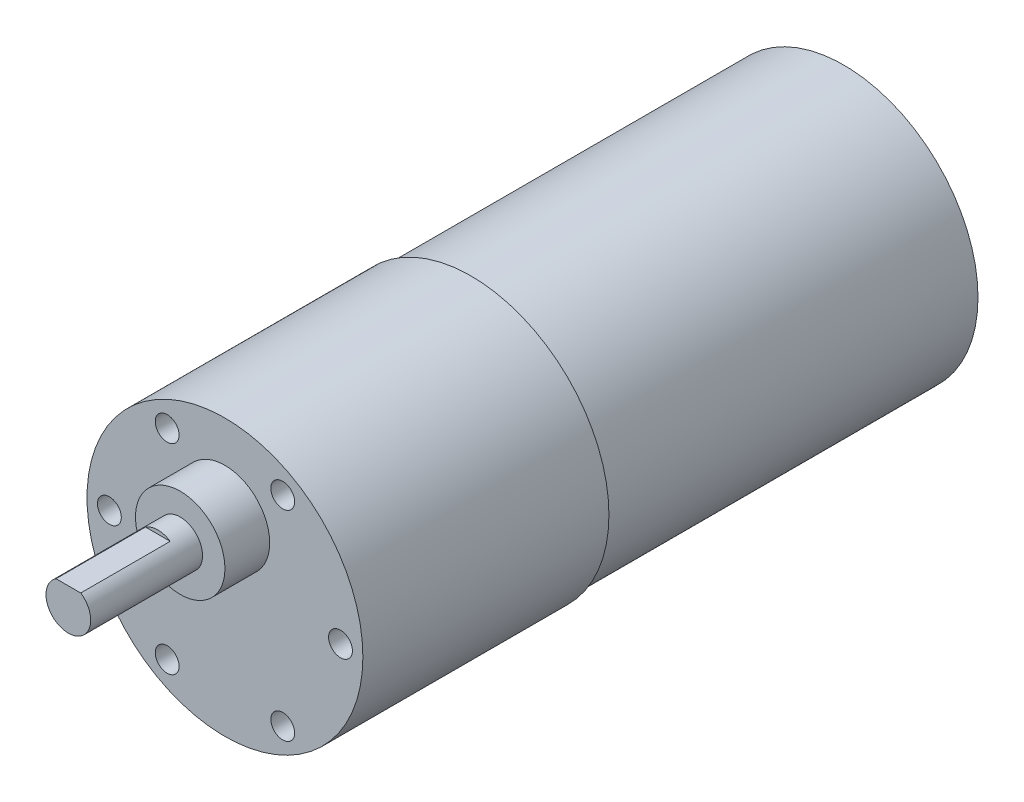
ISO-10303-21;
HEADER;
FILE_DESCRIPTION(('STEP AP214'),'2;1');
FILE_NAME('part.step','',(''),(''),'','','');
FILE_SCHEMA(('AUTOMOTIVE_DESIGN { 1 0 10303 214 1 1 1 1 }'));
ENDSEC;
DATA;
#1=APPLICATION_CONTEXT('core data for automotive mechanical design processes');
#2=APPLICATION_PROTOCOL_DEFINITION('international standard','automotive_design',2000,#1);
#3=PRODUCT_CONTEXT('',#1,'mechanical');
#4=PRODUCT('Part','Part','',(#3));
#5=PRODUCT_RELATED_PRODUCT_CATEGORY('part','',(#4));
#6=PRODUCT_DEFINITION_FORMATION('','',#4);
#7=PRODUCT_DEFINITION_CONTEXT('part definition',#1,'design');
#8=PRODUCT_DEFINITION('design','',#6,#7);
#9=PRODUCT_DEFINITION_SHAPE('','',#8);
#10=(LENGTH_UNIT() NAMED_UNIT(*) SI_UNIT(.MILLI.,.METRE.));
#11=(NAMED_UNIT(*) PLANE_ANGLE_UNIT() SI_UNIT($,.RADIAN.));
#12=(NAMED_UNIT(*) SI_UNIT($,.STERADIAN.) SOLID_ANGLE_UNIT());
#13=UNCERTAINTY_MEASURE_WITH_UNIT(LENGTH_MEASURE(1.E-05),#10,'distance_accuracy_value','');
#14=(GEOMETRIC_REPRESENTATION_CONTEXT(3) GLOBAL_UNCERTAINTY_ASSIGNED_CONTEXT((#13)) GLOBAL_UNIT_ASSIGNED_CONTEXT((#10,
#11,#12)) REPRESENTATION_CONTEXT('',''));
#15=CARTESIAN_POINT('',(0.,0.,0.));
#16=DIRECTION('',(0.,0.,1.));
#17=DIRECTION('',(1.,0.,0.));
#18=AXIS2_PLACEMENT_3D('',#15,#16,#17);
#19=CARTESIAN_POINT('',(0.,0.,33.));
#20=DIRECTION('',(0.,0.,-1.));
#21=DIRECTION('',(-1.,0.,0.));
#22=AXIS2_PLACEMENT_3D('',#19,#20,#21);
#23=CYLINDRICAL_SURFACE('',#22,18.5);
#24=CARTESIAN_POINT('',(0.,0.,33.));
#25=DIRECTION('',(0.,0.,1.));
#26=DIRECTION('',(1.,0.,0.));
#27=AXIS2_PLACEMENT_3D('',#24,#25,#26);
#28=CIRCLE('',#27,18.5);
#29=CARTESIAN_POINT('',(18.5,0.,33.));
#30=VERTEX_POINT('',#29);
#31=EDGE_CURVE('E123',#30,#30,#28,.T.);
#32=ORIENTED_EDGE('',*,*,#31,.F.);
#33=EDGE_LOOP('',(#32));
#34=FACE_BOUND('',#33,.T.);
#35=CARTESIAN_POINT('',(0.,0.,0.));
#36=DIRECTION('',(0.,0.,1.));
#37=DIRECTION('',(1.,0.,0.));
#38=AXIS2_PLACEMENT_3D('',#35,#36,#37);
#39=CIRCLE('',#38,18.5);
#40=CARTESIAN_POINT('',(18.5,0.,0.));
#41=VERTEX_POINT('',#40);
#42=EDGE_CURVE('E36',#41,#41,#39,.T.);
#43=ORIENTED_EDGE('',*,*,#42,.T.);
#44=EDGE_LOOP('',(#43));
#45=FACE_BOUND('',#44,.T.);
#46=ADVANCED_FACE('F33',(#34,#45),#23,.T.);
#47=CARTESIAN_POINT('',(0.,0.,33.));
#48=DIRECTION('',(0.,0.,1.));
#49=DIRECTION('',(1.,0.,0.));
#50=AXIS2_PLACEMENT_3D('',#47,#48,#49);
#51=PLANE('',#50);
#52=CARTESIAN_POINT('',(0.,7.,33.));
#53=DIRECTION('',(0.,0.,1.));
#54=DIRECTION('',(1.,0.,0.));
#55=AXIS2_PLACEMENT_3D('',#52,#53,#54);
#56=CIRCLE('',#55,6.);
#57=CARTESIAN_POINT('',(6.,7.,33.));
#58=VERTEX_POINT('',#57);
#59=EDGE_CURVE('E74',#58,#58,#56,.T.);
#60=ORIENTED_EDGE('',*,*,#59,.F.);
#61=EDGE_LOOP('',(#60));
#62=FACE_BOUND('',#61,.T.);
#63=CARTESIAN_POINT('',(-15.5,0.,33.));
#64=DIRECTION('',(0.,0.,1.));
#65=DIRECTION('',(1.,0.,0.));
#66=AXIS2_PLACEMENT_3D('',#63,#64,#65);
#67=CIRCLE('',#66,1.6);
#68=CARTESIAN_POINT('',(-13.9,0.,33.));
#69=VERTEX_POINT('',#68);
#70=EDGE_CURVE('E88',#69,#69,#67,.T.);
#71=ORIENTED_EDGE('',*,*,#70,.F.);
#72=EDGE_LOOP('',(#71));
#73=FACE_BOUND('',#72,.T.);
#74=CARTESIAN_POINT('',(-7.75000000000016,-13.4233937586587,33.));
#75=DIRECTION('',(0.,0.,1.));
#76=DIRECTION('',(1.,0.,0.));
#77=AXIS2_PLACEMENT_3D('',#74,#75,#76);
#78=CIRCLE('',#77,1.6);
#79=CARTESIAN_POINT('',(-6.15000000000016,-13.4233937586587,33.));
#80=VERTEX_POINT('',#79);
#81=EDGE_CURVE('E82',#80,#80,#78,.T.);
#82=ORIENTED_EDGE('',*,*,#81,.F.);
#83=EDGE_LOOP('',(#82));
#84=FACE_BOUND('',#83,.T.);
#85=CARTESIAN_POINT('',(7.74999999999987,-13.4233937586589,33.));
#86=DIRECTION('',(0.,0.,1.));
#87=DIRECTION('',(1.,0.,0.));
#88=AXIS2_PLACEMENT_3D('',#85,#86,#87);
#89=CIRCLE('',#88,1.6);
#90=CARTESIAN_POINT('',(9.34999999999988,-13.4233937586589,33.));
#91=VERTEX_POINT('',#90);
#92=EDGE_CURVE('E95',#91,#91,#89,.T.);
#93=ORIENTED_EDGE('',*,*,#92,.F.);
#94=EDGE_LOOP('',(#93));
#95=FACE_BOUND('',#94,.T.);
#96=CARTESIAN_POINT('',(15.5,-1.08235921504137E-13,33.));
#97=DIRECTION('',(0.,0.,1.));
#98=DIRECTION('',(1.,0.,0.));
#99=AXIS2_PLACEMENT_3D('',#96,#97,#98);
#100=CIRCLE('',#99,1.6);
#101=CARTESIAN_POINT('',(17.1,-1.08235921504137E-13,33.));
#102=VERTEX_POINT('',#101);
#103=EDGE_CURVE('E112',#102,#102,#100,.T.);
#104=ORIENTED_EDGE('',*,*,#103,.F.);
#105=EDGE_LOOP('',(#104));
#106=FACE_BOUND('',#105,.T.);
#107=CARTESIAN_POINT('',(7.75000000000006,13.4233937586588,33.));
#108=DIRECTION('',(0.,0.,1.));
#109=DIRECTION('',(1.,0.,0.));
#110=AXIS2_PLACEMENT_3D('',#107,#108,#109);
#111=CIRCLE('',#110,1.6);
#112=CARTESIAN_POINT('',(9.35000000000007,13.4233937586588,33.));
#113=VERTEX_POINT('',#112);
#114=EDGE_CURVE('E106',#113,#113,#111,.T.);
#115=ORIENTED_EDGE('',*,*,#114,.F.);
#116=EDGE_LOOP('',(#115));
#117=FACE_BOUND('',#116,.T.);
#118=CARTESIAN_POINT('',(-7.74999999999997,13.4233937586588,33.));
#119=DIRECTION('',(0.,0.,1.));
#120=DIRECTION('',(1.,0.,0.));
#121=AXIS2_PLACEMENT_3D('',#118,#119,#120);
#122=CIRCLE('',#121,1.6);
#123=CARTESIAN_POINT('',(-6.14999999999997,13.4233937586588,33.));
#124=VERTEX_POINT('',#123);
#125=EDGE_CURVE('E100',#124,#124,#122,.T.);
#126=ORIENTED_EDGE('',*,*,#125,.F.);
#127=EDGE_LOOP('',(#126));
#128=FACE_BOUND('',#127,.T.);
#129=ORIENTED_EDGE('',*,*,#31,.T.);
#130=EDGE_LOOP('',(#129));
#131=FACE_BOUND('',#130,.T.);
#132=ADVANCED_FACE('F134',(#62,#73,#84,#95,#106,#117,#128,#131),#51,.T.);
#133=CARTESIAN_POINT('',(0.,0.,0.));
#134=DIRECTION('',(0.,0.,1.));
#135=DIRECTION('',(1.,0.,0.));
#136=AXIS2_PLACEMENT_3D('',#133,#134,#135);
#137=PLANE('',#136);
#138=CARTESIAN_POINT('',(0.,0.,0.));
#139=DIRECTION('',(0.,0.,-1.));
#140=DIRECTION('',(-1.,0.,0.));
#141=AXIS2_PLACEMENT_3D('',#138,#139,#140);
#142=CIRCLE('',#141,18.);
#143=CARTESIAN_POINT('',(-18.,0.,0.));
#144=VERTEX_POINT('',#143);
#145=EDGE_CURVE('E41',#144,#144,#142,.T.);
#146=ORIENTED_EDGE('',*,*,#145,.F.);
#147=EDGE_LOOP('',(#146));
#148=FACE_BOUND('',#147,.T.);
#149=ORIENTED_EDGE('',*,*,#42,.F.);
#150=EDGE_LOOP('',(#149));
#151=FACE_BOUND('',#150,.T.);
#152=ADVANCED_FACE('F131',(#148,#151),#137,.F.);
#153=CARTESIAN_POINT('',(0.,0.,-50.));
#154=DIRECTION('',(0.,0.,1.));
#155=DIRECTION('',(1.,0.,0.));
#156=AXIS2_PLACEMENT_3D('',#153,#154,#155);
#157=CYLINDRICAL_SURFACE('',#156,18.);
#158=CARTESIAN_POINT('',(0.,0.,-50.));
#159=DIRECTION('',(0.,0.,-1.));
#160=DIRECTION('',(-1.,0.,0.));
#161=AXIS2_PLACEMENT_3D('',#158,#159,#160);
#162=CIRCLE('',#161,18.);
#163=CARTESIAN_POINT('',(-18.,0.,-50.));
#164=VERTEX_POINT('',#163);
#165=EDGE_CURVE('E87',#164,#164,#162,.T.);
#166=ORIENTED_EDGE('',*,*,#165,.F.);
#167=EDGE_LOOP('',(#166));
#168=FACE_BOUND('',#167,.T.);
#169=ORIENTED_EDGE('',*,*,#145,.T.);
#170=EDGE_LOOP('',(#169));
#171=FACE_BOUND('',#170,.T.);
#172=ADVANCED_FACE('F133',(#168,#171),#157,.T.);
#173=CARTESIAN_POINT('',(0.,0.,-50.));
#174=DIRECTION('',(0.,0.,-1.));
#175=DIRECTION('',(-1.,0.,0.));
#176=AXIS2_PLACEMENT_3D('',#173,#174,#175);
#177=PLANE('',#176);
#178=ORIENTED_EDGE('',*,*,#165,.T.);
#179=EDGE_LOOP('',(#178));
#180=FACE_BOUND('',#179,.T.);
#181=ADVANCED_FACE('F140',(#180),#177,.T.);
#182=CARTESIAN_POINT('',(-7.74999999999997,13.4233937586588,27.));
#183=DIRECTION('',(0.,0.,1.));
#184=DIRECTION('',(1.,0.,0.));
#185=AXIS2_PLACEMENT_3D('',#182,#183,#184);
#186=CYLINDRICAL_SURFACE('',#185,1.6);
#187=CARTESIAN_POINT('',(-7.74999999999997,13.4233937586588,27.));
#188=DIRECTION('',(0.,0.,1.));
#189=DIRECTION('',(1.,0.,0.));
#190=AXIS2_PLACEMENT_3D('',#187,#188,#189);
#191=CIRCLE('',#190,1.6);
#192=CARTESIAN_POINT('',(-6.14999999999997,13.4233937586588,27.));
#193=VERTEX_POINT('',#192);
#194=EDGE_CURVE('E91',#193,#193,#191,.T.);
#195=ORIENTED_EDGE('',*,*,#194,.F.);
#196=EDGE_LOOP('',(#195));
#197=FACE_BOUND('',#196,.T.);
#198=ORIENTED_EDGE('',*,*,#125,.T.);
#199=EDGE_LOOP('',(#198));
#200=FACE_BOUND('',#199,.T.);
#201=ADVANCED_FACE('F239',(#197,#200),#186,.F.);
#202=CARTESIAN_POINT('',(-7.74999999999997,13.4233937586588,27.));
#203=DIRECTION('',(0.,0.,1.));
#204=DIRECTION('',(1.,0.,0.));
#205=AXIS2_PLACEMENT_3D('',#202,#203,#204);
#206=PLANE('',#205);
#207=ORIENTED_EDGE('',*,*,#194,.T.);
#208=EDGE_LOOP('',(#207));
#209=FACE_BOUND('',#208,.T.);
#210=ADVANCED_FACE('F235',(#209),#206,.T.);
#211=CARTESIAN_POINT('',(7.75000000000006,13.4233937586588,27.));
#212=DIRECTION('',(0.,0.,1.));
#213=DIRECTION('',(1.,0.,0.));
#214=AXIS2_PLACEMENT_3D('',#211,#212,#213);
#215=CYLINDRICAL_SURFACE('',#214,1.6);
#216=CARTESIAN_POINT('',(7.75000000000006,13.4233937586588,27.));
#217=DIRECTION('',(0.,0.,1.));
#218=DIRECTION('',(1.,0.,0.));
#219=AXIS2_PLACEMENT_3D('',#216,#217,#218);
#220=CIRCLE('',#219,1.6);
#221=CARTESIAN_POINT('',(9.35000000000007,13.4233937586588,27.));
#222=VERTEX_POINT('',#221);
#223=EDGE_CURVE('E103',#222,#222,#220,.T.);
#224=ORIENTED_EDGE('',*,*,#223,.F.);
#225=EDGE_LOOP('',(#224));
#226=FACE_BOUND('',#225,.T.);
#227=ORIENTED_EDGE('',*,*,#114,.T.);
#228=EDGE_LOOP('',(#227));
#229=FACE_BOUND('',#228,.T.);
#230=ADVANCED_FACE('F238',(#226,#229),#215,.F.);
#231=CARTESIAN_POINT('',(7.75000000000006,13.4233937586588,27.));
#232=DIRECTION('',(0.,0.,1.));
#233=DIRECTION('',(1.,0.,0.));
#234=AXIS2_PLACEMENT_3D('',#231,#232,#233);
#235=PLANE('',#234);
#236=ORIENTED_EDGE('',*,*,#223,.T.);
#237=EDGE_LOOP('',(#236));
#238=FACE_BOUND('',#237,.T.);
#239=ADVANCED_FACE('F244',(#238),#235,.T.);
#240=CARTESIAN_POINT('',(15.5,-1.08235921504137E-13,27.));
#241=DIRECTION('',(0.,0.,1.));
#242=DIRECTION('',(1.,0.,0.));
#243=AXIS2_PLACEMENT_3D('',#240,#241,#242);
#244=CYLINDRICAL_SURFACE('',#243,1.6);
#245=CARTESIAN_POINT('',(15.5,-1.08235921504137E-13,27.));
#246=DIRECTION('',(0.,0.,1.));
#247=DIRECTION('',(1.,0.,0.));
#248=AXIS2_PLACEMENT_3D('',#245,#246,#247);
#249=CIRCLE('',#248,1.6);
#250=CARTESIAN_POINT('',(17.1,-1.08235921504137E-13,27.));
#251=VERTEX_POINT('',#250);
#252=EDGE_CURVE('E109',#251,#251,#249,.T.);
#253=ORIENTED_EDGE('',*,*,#252,.F.);
#254=EDGE_LOOP('',(#253));
#255=FACE_BOUND('',#254,.T.);
#256=ORIENTED_EDGE('',*,*,#103,.T.);
#257=EDGE_LOOP('',(#256));
#258=FACE_BOUND('',#257,.T.);
#259=ADVANCED_FACE('F247',(#255,#258),#244,.F.);
#260=CARTESIAN_POINT('',(15.5,-1.08235921504137E-13,27.));
#261=DIRECTION('',(0.,0.,1.));
#262=DIRECTION('',(1.,0.,0.));
#263=AXIS2_PLACEMENT_3D('',#260,#261,#262);
#264=PLANE('',#263);
#265=ORIENTED_EDGE('',*,*,#252,.T.);
#266=EDGE_LOOP('',(#265));
#267=FACE_BOUND('',#266,.T.);
#268=ADVANCED_FACE('F252',(#267),#264,.T.);
#269=CARTESIAN_POINT('',(7.74999999999987,-13.4233937586589,27.));
#270=DIRECTION('',(0.,0.,1.));
#271=DIRECTION('',(1.,0.,0.));
#272=AXIS2_PLACEMENT_3D('',#269,#270,#271);
#273=CYLINDRICAL_SURFACE('',#272,1.6);
#274=CARTESIAN_POINT('',(7.74999999999987,-13.4233937586589,27.));
#275=DIRECTION('',(0.,0.,1.));
#276=DIRECTION('',(1.,0.,0.));
#277=AXIS2_PLACEMENT_3D('',#274,#275,#276);
#278=CIRCLE('',#277,1.6);
#279=CARTESIAN_POINT('',(9.34999999999988,-13.4233937586589,27.));
#280=VERTEX_POINT('',#279);
#281=EDGE_CURVE('E115',#280,#280,#278,.T.);
#282=ORIENTED_EDGE('',*,*,#281,.F.);
#283=EDGE_LOOP('',(#282));
#284=FACE_BOUND('',#283,.T.);
#285=ORIENTED_EDGE('',*,*,#92,.T.);
#286=EDGE_LOOP('',(#285));
#287=FACE_BOUND('',#286,.T.);
#288=ADVANCED_FACE('F255',(#284,#287),#273,.F.);
#289=CARTESIAN_POINT('',(7.74999999999987,-13.4233937586589,27.));
#290=DIRECTION('',(0.,0.,1.));
#291=DIRECTION('',(1.,0.,0.));
#292=AXIS2_PLACEMENT_3D('',#289,#290,#291);
#293=PLANE('',#292);
#294=ORIENTED_EDGE('',*,*,#281,.T.);
#295=EDGE_LOOP('',(#294));
#296=FACE_BOUND('',#295,.T.);
#297=ADVANCED_FACE('F233',(#296),#293,.T.);
#298=CARTESIAN_POINT('',(-7.75000000000016,-13.4233937586587,27.));
#299=DIRECTION('',(0.,0.,1.));
#300=DIRECTION('',(1.,0.,0.));
#301=AXIS2_PLACEMENT_3D('',#298,#299,#300);
#302=CYLINDRICAL_SURFACE('',#301,1.6);
#303=CARTESIAN_POINT('',(-7.75000000000016,-13.4233937586587,27.));
#304=DIRECTION('',(0.,0.,1.));
#305=DIRECTION('',(1.,0.,0.));
#306=AXIS2_PLACEMENT_3D('',#303,#304,#305);
#307=CIRCLE('',#306,1.6);
#308=CARTESIAN_POINT('',(-6.15000000000016,-13.4233937586587,27.));
#309=VERTEX_POINT('',#308);
#310=EDGE_CURVE('E92',#309,#309,#307,.T.);
#311=ORIENTED_EDGE('',*,*,#310,.F.);
#312=EDGE_LOOP('',(#311));
#313=FACE_BOUND('',#312,.T.);
#314=ORIENTED_EDGE('',*,*,#81,.T.);
#315=EDGE_LOOP('',(#314));
#316=FACE_BOUND('',#315,.T.);
#317=ADVANCED_FACE('F229',(#313,#316),#302,.F.);
#318=CARTESIAN_POINT('',(-7.75000000000016,-13.4233937586587,27.));
#319=DIRECTION('',(0.,0.,1.));
#320=DIRECTION('',(1.,0.,0.));
#321=AXIS2_PLACEMENT_3D('',#318,#319,#320);
#322=PLANE('',#321);
#323=ORIENTED_EDGE('',*,*,#310,.T.);
#324=EDGE_LOOP('',(#323));
#325=FACE_BOUND('',#324,.T.);
#326=ADVANCED_FACE('F225',(#325),#322,.T.);
#327=CARTESIAN_POINT('',(-15.5,0.,27.));
#328=DIRECTION('',(0.,0.,1.));
#329=DIRECTION('',(1.,0.,0.));
#330=AXIS2_PLACEMENT_3D('',#327,#328,#329);
#331=CYLINDRICAL_SURFACE('',#330,1.6);
#332=CARTESIAN_POINT('',(-15.5,0.,27.));
#333=DIRECTION('',(0.,0.,1.));
#334=DIRECTION('',(1.,0.,0.));
#335=AXIS2_PLACEMENT_3D('',#332,#333,#334);
#336=CIRCLE('',#335,1.6);
#337=CARTESIAN_POINT('',(-13.9,0.,27.));
#338=VERTEX_POINT('',#337);
#339=EDGE_CURVE('E84',#338,#338,#336,.T.);
#340=ORIENTED_EDGE('',*,*,#339,.F.);
#341=EDGE_LOOP('',(#340));
#342=FACE_BOUND('',#341,.T.);
#343=ORIENTED_EDGE('',*,*,#70,.T.);
#344=EDGE_LOOP('',(#343));
#345=FACE_BOUND('',#344,.T.);
#346=ADVANCED_FACE('F221',(#342,#345),#331,.F.);
#347=CARTESIAN_POINT('',(-15.5,0.,27.));
#348=DIRECTION('',(0.,0.,1.));
#349=DIRECTION('',(1.,0.,0.));
#350=AXIS2_PLACEMENT_3D('',#347,#348,#349);
#351=PLANE('',#350);
#352=ORIENTED_EDGE('',*,*,#339,.T.);
#353=EDGE_LOOP('',(#352));
#354=FACE_BOUND('',#353,.T.);
#355=ADVANCED_FACE('F161',(#354),#351,.T.);
#356=CARTESIAN_POINT('',(0.,7.,39.));
#357=DIRECTION('',(0.,0.,-1.));
#358=DIRECTION('',(-1.,0.,0.));
#359=AXIS2_PLACEMENT_3D('',#356,#357,#358);
#360=CYLINDRICAL_SURFACE('',#359,6.);
#361=CARTESIAN_POINT('',(0.,7.,39.));
#362=DIRECTION('',(0.,0.,1.));
#363=DIRECTION('',(1.,0.,0.));
#364=AXIS2_PLACEMENT_3D('',#361,#362,#363);
#365=CIRCLE('',#364,6.);
#366=CARTESIAN_POINT('',(6.,7.,39.));
#367=VERTEX_POINT('',#366);
#368=EDGE_CURVE('E77',#367,#367,#365,.T.);
#369=ORIENTED_EDGE('',*,*,#368,.F.);
#370=EDGE_LOOP('',(#369));
#371=FACE_BOUND('',#370,.T.);
#372=ORIENTED_EDGE('',*,*,#59,.T.);
#373=EDGE_LOOP('',(#372));
#374=FACE_BOUND('',#373,.T.);
#375=ADVANCED_FACE('F166',(#371,#374),#360,.T.);
#376=CARTESIAN_POINT('',(0.,7.,39.));
#377=DIRECTION('',(0.,0.,1.));
#378=DIRECTION('',(1.,0.,0.));
#379=AXIS2_PLACEMENT_3D('',#376,#377,#378);
#380=PLANE('',#379);
#381=CARTESIAN_POINT('',(0.,7.,39.));
#382=DIRECTION('',(0.,0.,1.));
#383=DIRECTION('',(1.,0.,0.));
#384=AXIS2_PLACEMENT_3D('',#381,#382,#383);
#385=CIRCLE('',#384,3.);
#386=CARTESIAN_POINT('',(3.,7.,39.));
#387=VERTEX_POINT('',#386);
#388=EDGE_CURVE('E11',#387,#387,#385,.T.);
#389=ORIENTED_EDGE('',*,*,#388,.F.);
#390=EDGE_LOOP('',(#389));
#391=FACE_BOUND('',#390,.T.);
#392=ORIENTED_EDGE('',*,*,#368,.T.);
#393=EDGE_LOOP('',(#392));
#394=FACE_BOUND('',#393,.T.);
#395=ADVANCED_FACE('F171',(#391,#394),#380,.T.);
#396=CARTESIAN_POINT('',(0.,7.,54.));
#397=DIRECTION('',(0.,0.,-1.));
#398=DIRECTION('',(-1.,0.,0.));
#399=AXIS2_PLACEMENT_3D('',#396,#397,#398);
#400=CYLINDRICAL_SURFACE('',#399,3.);
#401=CARTESIAN_POINT('',(0.,7.,54.));
#402=DIRECTION('',(0.,0.,1.));
#403=DIRECTION('',(1.,0.,0.));
#404=AXIS2_PLACEMENT_3D('',#401,#402,#403);
#405=CIRCLE('',#404,3.);
#406=CARTESIAN_POINT('',(-1.6583123951777,9.5,54.));
#407=VERTEX_POINT('',#406);
#408=CARTESIAN_POINT('',(1.6583123951777,9.5,54.));
#409=VERTEX_POINT('',#408);
#410=EDGE_CURVE('E71',#407,#409,#405,.T.);
#411=ORIENTED_EDGE('',*,*,#410,.F.);
#412=DIRECTION('',(0.,0.,1.));
#413=VECTOR('',#412,1.);
#414=CARTESIAN_POINT('',(-1.6583123951777,9.5,42.));
#415=LINE('',#414,#413);
#416=CARTESIAN_POINT('',(-1.6583123951777,9.5,42.));
#417=VERTEX_POINT('',#416);
#418=EDGE_CURVE('E49',#417,#407,#415,.T.);
#419=ORIENTED_EDGE('',*,*,#418,.F.);
#420=CARTESIAN_POINT('',(0.,7.,42.));
#421=DIRECTION('',(0.,0.,1.));
#422=DIRECTION('',(1.,0.,0.));
#423=AXIS2_PLACEMENT_3D('',#420,#421,#422);
#424=CIRCLE('',#423,3.);
#425=CARTESIAN_POINT('',(1.6583123951777,9.5,42.));
#426=VERTEX_POINT('',#425);
#427=EDGE_CURVE('E65',#426,#417,#424,.T.);
#428=ORIENTED_EDGE('',*,*,#427,.F.);
#429=DIRECTION('',(0.,0.,1.));
#430=VECTOR('',#429,1.);
#431=CARTESIAN_POINT('',(1.6583123951777,9.5,42.));
#432=LINE('',#431,#430);
#433=EDGE_CURVE('E55',#426,#409,#432,.T.);
#434=ORIENTED_EDGE('',*,*,#433,.T.);
#435=EDGE_LOOP('',(#411,#419,#428,#434));
#436=FACE_BOUND('',#435,.T.);
#437=ORIENTED_EDGE('',*,*,#388,.T.);
#438=EDGE_LOOP('',(#437));
#439=FACE_BOUND('',#438,.T.);
#440=ADVANCED_FACE('F69',(#436,#439),#400,.T.);
#441=CARTESIAN_POINT('',(0.,7.,54.));
#442=DIRECTION('',(0.,0.,1.));
#443=DIRECTION('',(1.,0.,0.));
#444=AXIS2_PLACEMENT_3D('',#441,#442,#443);
#445=PLANE('',#444);
#446=DIRECTION('',(1.,0.,0.));
#447=VECTOR('',#446,1.);
#448=CARTESIAN_POINT('',(-1.6583123951777,9.5,54.));
#449=LINE('',#448,#447);
#450=EDGE_CURVE('E60',#407,#409,#449,.T.);
#451=ORIENTED_EDGE('',*,*,#450,.F.);
#452=ORIENTED_EDGE('',*,*,#410,.T.);
#453=EDGE_LOOP('',(#451,#452));
#454=FACE_BOUND('',#453,.T.);
#455=ADVANCED_FACE('F73',(#454),#445,.T.);
#456=CARTESIAN_POINT('',(-1.6583123951777,9.5,42.));
#457=DIRECTION('',(0.,-1.,0.));
#458=DIRECTION('',(0.,0.,-1.));
#459=AXIS2_PLACEMENT_3D('',#456,#457,#458);
#460=PLANE('',#459);
#461=ORIENTED_EDGE('',*,*,#450,.T.);
#462=ORIENTED_EDGE('',*,*,#433,.F.);
#463=DIRECTION('',(1.,0.,0.));
#464=VECTOR('',#463,1.);
#465=CARTESIAN_POINT('',(-1.6583123951777,9.5,42.));
#466=LINE('',#465,#464);
#467=EDGE_CURVE('E377',#417,#426,#466,.T.);
#468=ORIENTED_EDGE('',*,*,#467,.F.);
#469=ORIENTED_EDGE('',*,*,#418,.T.);
#470=EDGE_LOOP('',(#461,#462,#468,#469));
#471=FACE_BOUND('',#470,.T.);
#472=ADVANCED_FACE('F61',(#471),#460,.F.);
#473=CARTESIAN_POINT('',(0.,7.,42.));
#474=DIRECTION('',(0.,0.,1.));
#475=DIRECTION('',(1.,0.,0.));
#476=AXIS2_PLACEMENT_3D('',#473,#474,#475);
#477=PLANE('',#476);
#478=ORIENTED_EDGE('',*,*,#427,.T.);
#479=ORIENTED_EDGE('',*,*,#467,.T.);
#480=EDGE_LOOP('',(#478,#479));
#481=FACE_BOUND('',#480,.T.);
#482=ADVANCED_FACE('F206',(#481),#477,.T.);
#483=CLOSED_SHELL('',(#46,#132,#152,#172,#181,#201,#210,#230,#239,#259,#268,#288,#297,#317,#326,
#346,#355,#375,#395,#440,#455,#472,#482));
#484=MANIFOLD_SOLID_BREP('B2',#483);
#485=ADVANCED_BREP_SHAPE_REPRESENTATION('',(#18,#484),#14);
#486=SHAPE_DEFINITION_REPRESENTATION(#9,#485);
ENDSEC;
END-ISO-10303-21;
